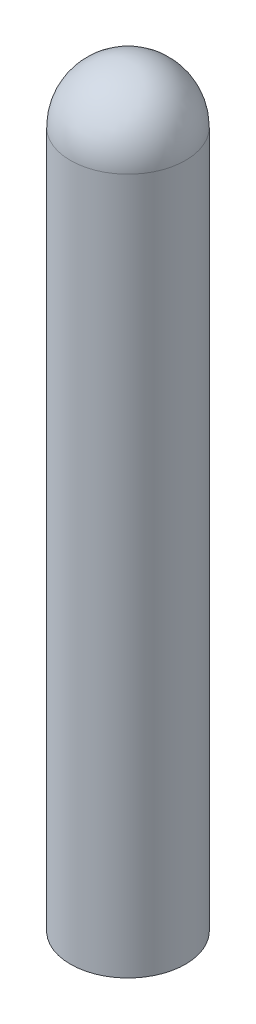
ISO-10303-21;
HEADER;
FILE_DESCRIPTION(('STEP AP214'),'2;1');
FILE_NAME('part.step','',(''),(''),'','','');
FILE_SCHEMA(('AUTOMOTIVE_DESIGN { 1 0 10303 214 1 1 1 1 }'));
ENDSEC;
DATA;
#1=APPLICATION_CONTEXT('core data for automotive mechanical design processes');
#2=APPLICATION_PROTOCOL_DEFINITION('international standard','automotive_design',2000,#1);
#3=PRODUCT_CONTEXT('',#1,'mechanical');
#4=PRODUCT('Part','Part','',(#3));
#5=PRODUCT_RELATED_PRODUCT_CATEGORY('part','',(#4));
#6=PRODUCT_DEFINITION_FORMATION('','',#4);
#7=PRODUCT_DEFINITION_CONTEXT('part definition',#1,'design');
#8=PRODUCT_DEFINITION('design','',#6,#7);
#9=PRODUCT_DEFINITION_SHAPE('','',#8);
#10=(LENGTH_UNIT() NAMED_UNIT(*) SI_UNIT(.MILLI.,.METRE.));
#11=(NAMED_UNIT(*) PLANE_ANGLE_UNIT() SI_UNIT($,.RADIAN.));
#12=(NAMED_UNIT(*) SI_UNIT($,.STERADIAN.) SOLID_ANGLE_UNIT());
#13=UNCERTAINTY_MEASURE_WITH_UNIT(LENGTH_MEASURE(1.E-05),#10,'distance_accuracy_value','');
#14=(GEOMETRIC_REPRESENTATION_CONTEXT(3) GLOBAL_UNCERTAINTY_ASSIGNED_CONTEXT((#13)) GLOBAL_UNIT_ASSIGNED_CONTEXT((#10,
#11,#12)) REPRESENTATION_CONTEXT('',''));
#15=CARTESIAN_POINT('',(0.,0.,0.));
#16=DIRECTION('',(0.,0.,1.));
#17=DIRECTION('',(1.,0.,0.));
#18=AXIS2_PLACEMENT_3D('',#15,#16,#17);
#19=CARTESIAN_POINT('',(0.,0.,0.));
#20=DIRECTION('',(0.,1.,0.));
#21=DIRECTION('',(0.,0.,1.));
#22=AXIS2_PLACEMENT_3D('',#19,#20,#21);
#23=PLANE('',#22);
#24=CARTESIAN_POINT('',(0.,0.,0.));
#25=DIRECTION('',(0.,1.,0.));
#26=DIRECTION('',(0.,0.,1.));
#27=AXIS2_PLACEMENT_3D('',#24,#25,#26);
#28=CIRCLE('',#27,7.85);
#29=CARTESIAN_POINT('',(0.,0.,7.85));
#30=VERTEX_POINT('',#29);
#31=EDGE_CURVE('E47',#30,#30,#28,.T.);
#32=ORIENTED_EDGE('',*,*,#31,.F.);
#33=EDGE_LOOP('',(#32));
#34=FACE_BOUND('',#33,.T.);
#35=CARTESIAN_POINT('',(0.,0.,0.));
#36=DIRECTION('',(0.,1.,0.));
#37=DIRECTION('',(0.,0.,1.));
#38=AXIS2_PLACEMENT_3D('',#35,#36,#37);
#39=CIRCLE('',#38,6.9);
#40=CARTESIAN_POINT('',(0.,0.,6.9));
#41=VERTEX_POINT('',#40);
#42=EDGE_CURVE('E52',#41,#41,#39,.T.);
#43=ORIENTED_EDGE('',*,*,#42,.T.);
#44=EDGE_LOOP('',(#43));
#45=FACE_BOUND('',#44,.T.);
#46=ADVANCED_FACE('F36',(#34,#45),#23,.F.);
#47=CARTESIAN_POINT('',(0.,95.,0.));
#48=DIRECTION('',(0.,-1.,0.));
#49=DIRECTION('',(0.,0.,-1.));
#50=AXIS2_PLACEMENT_3D('',#47,#48,#49);
#51=CYLINDRICAL_SURFACE('',#50,7.85);
#52=CARTESIAN_POINT('',(0.,95.,0.));
#53=DIRECTION('',(0.,1.,0.));
#54=DIRECTION('',(0.,0.,1.));
#55=AXIS2_PLACEMENT_3D('',#52,#53,#54);
#56=CIRCLE('',#55,7.85);
#57=CARTESIAN_POINT('',(0.,95.,7.85));
#58=VERTEX_POINT('',#57);
#59=EDGE_CURVE('E43',#58,#58,#56,.T.);
#60=ORIENTED_EDGE('',*,*,#59,.F.);
#61=EDGE_LOOP('',(#60));
#62=FACE_BOUND('',#61,.T.);
#63=ORIENTED_EDGE('',*,*,#31,.T.);
#64=EDGE_LOOP('',(#63));
#65=FACE_BOUND('',#64,.T.);
#66=ADVANCED_FACE('F38',(#62,#65),#51,.T.);
#67=CARTESIAN_POINT('',(0.,95.,0.));
#68=DIRECTION('',(0.,-1.,0.));
#69=DIRECTION('',(0.,0.,-1.));
#70=AXIS2_PLACEMENT_3D('',#67,#68,#69);
#71=CYLINDRICAL_SURFACE('',#70,6.9);
#72=CARTESIAN_POINT('',(0.,91.256672603151,0.));
#73=DIRECTION('',(0.,1.,0.));
#74=DIRECTION('',(0.,0.,1.));
#75=AXIS2_PLACEMENT_3D('',#72,#73,#74);
#76=CIRCLE('',#75,6.9);
#77=CARTESIAN_POINT('',(0.,91.256672603151,6.9));
#78=VERTEX_POINT('',#77);
#79=EDGE_CURVE('E10',#78,#78,#76,.F.);
#80=ORIENTED_EDGE('',*,*,#79,.F.);
#81=EDGE_LOOP('',(#80));
#82=FACE_BOUND('',#81,.T.);
#83=ORIENTED_EDGE('',*,*,#42,.F.);
#84=EDGE_LOOP('',(#83));
#85=FACE_BOUND('',#84,.T.);
#86=ADVANCED_FACE('F58',(#82,#85),#71,.F.);
#87=CARTESIAN_POINT('',(0.,95.,0.));
#88=DIRECTION('',(0.,0.,-1.));
#89=DIRECTION('',(1.,0.,0.));
#90=AXIS2_PLACEMENT_3D('',#87,#88,#89);
#91=SPHERICAL_SURFACE('',#90,7.85);
#92=CARTESIAN_POINT('',(0.,95.,0.));
#93=DIRECTION('',(0.,1.,0.));
#94=DIRECTION('',(0.,0.,1.));
#95=AXIS2_PLACEMENT_3D('',#92,#93,#94);
#96=SPHERICAL_SURFACE('',#95,7.85);
#97=ORIENTED_EDGE('',*,*,#79,.T.);
#98=EDGE_LOOP('',(#97));
#99=FACE_BOUND('',#98,.T.);
#100=ADVANCED_FACE('F60',(#99),#96,.T.);
#101=CARTESIAN_POINT('',(0.,95.,0.));
#102=DIRECTION('',(0.,1.,0.));
#103=DIRECTION('',(0.,0.,1.));
#104=AXIS2_PLACEMENT_3D('',#101,#102,#103);
#105=SPHERICAL_SURFACE('',#104,7.85);
#106=ORIENTED_EDGE('',*,*,#59,.T.);
#107=EDGE_LOOP('',(#106));
#108=FACE_BOUND('',#107,.T.);
#109=ADVANCED_FACE('F67',(#108),#105,.T.);
#110=CLOSED_SHELL('',(#46,#66,#86,#100,#109));
#111=CARTESIAN_POINT('',(0.,95.,0.));
#112=DIRECTION('',(0.,0.,-1.));
#113=DIRECTION('',(1.,0.,0.));
#114=AXIS2_PLACEMENT_3D('',#111,#112,#113);
#115=SPHERICAL_SURFACE('',#114,6.9);
#116=CARTESIAN_POINT('',(0.,95.,-6.9));
#117=VERTEX_POINT('',#116);
#118=VERTEX_LOOP('',#117);
#119=FACE_BOUND('',#118,.T.);
#120=ADVANCED_FACE('F106',(#119),#115,.F.);
#121=CLOSED_SHELL('',(#120));
#122=ORIENTED_CLOSED_SHELL('',*,#121,.T.);
#123=BREP_WITH_VOIDS('B2',#110,(#122));
#124=ADVANCED_BREP_SHAPE_REPRESENTATION('',(#18,#123),#14);
#125=SHAPE_DEFINITION_REPRESENTATION(#9,#124);
ENDSEC;
END-ISO-10303-21;
